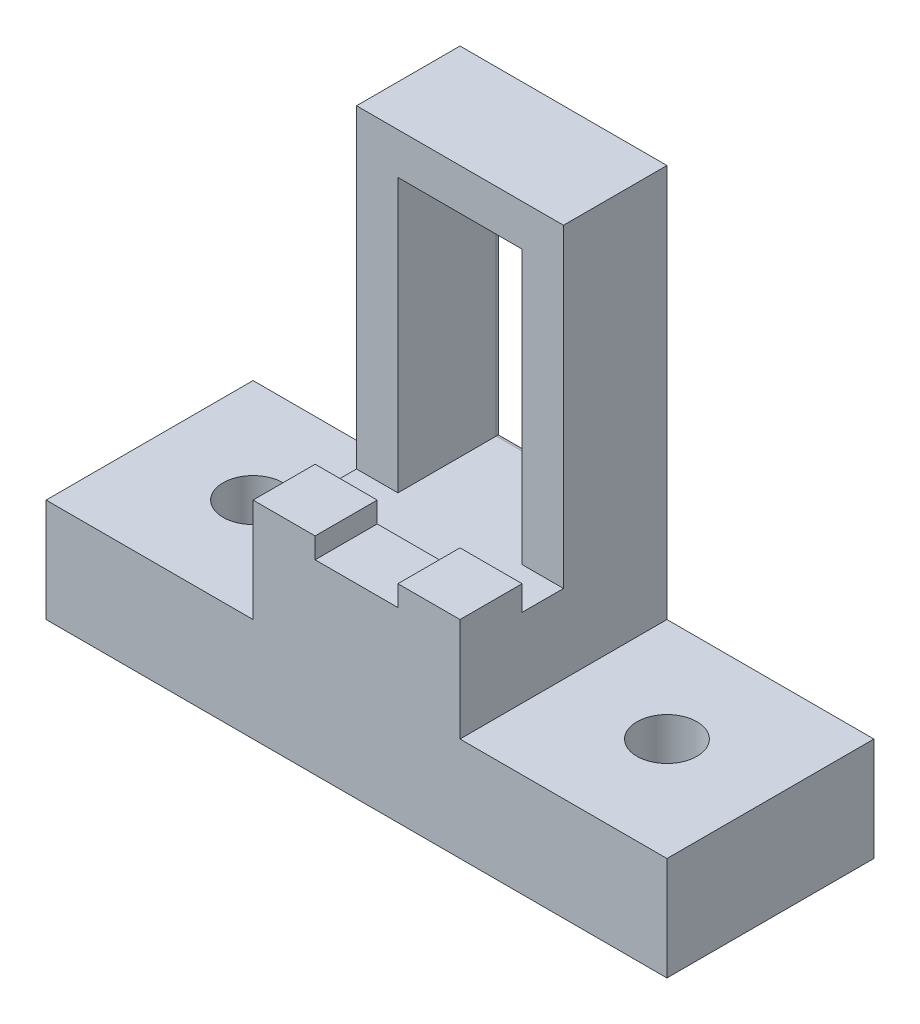
ISO-10303-21;
HEADER;
FILE_DESCRIPTION(('STEP AP214'),'2;1');
FILE_NAME('part.step','',(''),(''),'','','');
FILE_SCHEMA(('AUTOMOTIVE_DESIGN { 1 0 10303 214 1 1 1 1 }'));
ENDSEC;
DATA;
#1=APPLICATION_CONTEXT('core data for automotive mechanical design processes');
#2=APPLICATION_PROTOCOL_DEFINITION('international standard','automotive_design',2000,#1);
#3=PRODUCT_CONTEXT('',#1,'mechanical');
#4=PRODUCT('Part','Part','',(#3));
#5=PRODUCT_RELATED_PRODUCT_CATEGORY('part','',(#4));
#6=PRODUCT_DEFINITION_FORMATION('','',#4);
#7=PRODUCT_DEFINITION_CONTEXT('part definition',#1,'design');
#8=PRODUCT_DEFINITION('design','',#6,#7);
#9=PRODUCT_DEFINITION_SHAPE('','',#8);
#10=(LENGTH_UNIT() NAMED_UNIT(*) SI_UNIT(.MILLI.,.METRE.));
#11=(NAMED_UNIT(*) PLANE_ANGLE_UNIT() SI_UNIT($,.RADIAN.));
#12=(NAMED_UNIT(*) SI_UNIT($,.STERADIAN.) SOLID_ANGLE_UNIT());
#13=UNCERTAINTY_MEASURE_WITH_UNIT(LENGTH_MEASURE(1.E-05),#10,'distance_accuracy_value','');
#14=(GEOMETRIC_REPRESENTATION_CONTEXT(3) GLOBAL_UNCERTAINTY_ASSIGNED_CONTEXT((#13)) GLOBAL_UNIT_ASSIGNED_CONTEXT((#10,
#11,#12)) REPRESENTATION_CONTEXT('',''));
#15=CARTESIAN_POINT('',(0.,0.,0.));
#16=DIRECTION('',(0.,0.,1.));
#17=DIRECTION('',(1.,0.,0.));
#18=AXIS2_PLACEMENT_3D('',#15,#16,#17);
#19=CARTESIAN_POINT('',(-12.,8.8,-0.5));
#20=DIRECTION('',(0.,-1.,0.));
#21=DIRECTION('',(1.,0.,0.));
#22=AXIS2_PLACEMENT_3D('',#19,#20,#21);
#23=PLANE('',#22);
#24=DIRECTION('',(-1.,0.,0.));
#25=VECTOR('',#24,1.);
#26=CARTESIAN_POINT('',(-10.,8.8,-3.));
#27=LINE('',#26,#25);
#28=CARTESIAN_POINT('',(-10.,8.8,-3.));
#29=VERTEX_POINT('',#28);
#30=CARTESIAN_POINT('',(-20.,8.8,-3.));
#31=VERTEX_POINT('',#30);
#32=EDGE_CURVE('E367',#29,#31,#27,.T.);
#33=ORIENTED_EDGE('',*,*,#32,.F.);
#34=DIRECTION('',(0.,0.,-1.));
#35=VECTOR('',#34,1.);
#36=CARTESIAN_POINT('',(-10.,8.8,-5.));
#37=LINE('',#36,#35);
#38=CARTESIAN_POINT('',(-10.,8.8,-5.));
#39=VERTEX_POINT('',#38);
#40=EDGE_CURVE('E309',#29,#39,#37,.T.);
#41=ORIENTED_EDGE('',*,*,#40,.T.);
#42=DIRECTION('',(-1.,0.,0.));
#43=VECTOR('',#42,1.);
#44=CARTESIAN_POINT('',(-20.,8.8,-5.));
#45=LINE('',#44,#43);
#46=CARTESIAN_POINT('',(-12.,8.8,-5.));
#47=VERTEX_POINT('',#46);
#48=EDGE_CURVE('E311',#39,#47,#45,.T.);
#49=ORIENTED_EDGE('',*,*,#48,.T.);
#50=DIRECTION('',(0.,0.,-1.));
#51=VECTOR('',#50,1.);
#52=CARTESIAN_POINT('',(-12.,8.8,-0.5));
#53=LINE('',#52,#51);
#54=CARTESIAN_POINT('',(-12.,8.8,-9.75));
#55=VERTEX_POINT('',#54);
#56=EDGE_CURVE('E329',#47,#55,#53,.T.);
#57=ORIENTED_EDGE('',*,*,#56,.T.);
#58=DIRECTION('',(-1.,0.,0.));
#59=VECTOR('',#58,1.);
#60=CARTESIAN_POINT('',(-12.,8.8,-9.75));
#61=LINE('',#60,#59);
#62=CARTESIAN_POINT('',(-18.,8.8,-9.75));
#63=VERTEX_POINT('',#62);
#64=EDGE_CURVE('E245',#55,#63,#61,.T.);
#65=ORIENTED_EDGE('',*,*,#64,.T.);
#66=DIRECTION('',(0.,0.,-1.));
#67=VECTOR('',#66,1.);
#68=CARTESIAN_POINT('',(-18.,8.8,-0.5));
#69=LINE('',#68,#67);
#70=CARTESIAN_POINT('',(-18.,8.8,-5.));
#71=VERTEX_POINT('',#70);
#72=EDGE_CURVE('E335',#71,#63,#69,.T.);
#73=ORIENTED_EDGE('',*,*,#72,.F.);
#74=DIRECTION('',(1.,0.,0.));
#75=VECTOR('',#74,1.);
#76=CARTESIAN_POINT('',(-20.,8.8,-5.));
#77=LINE('',#76,#75);
#78=CARTESIAN_POINT('',(-20.,8.8,-5.));
#79=VERTEX_POINT('',#78);
#80=EDGE_CURVE('E235',#79,#71,#77,.T.);
#81=ORIENTED_EDGE('',*,*,#80,.F.);
#82=DIRECTION('',(0.,0.,1.));
#83=VECTOR('',#82,1.);
#84=CARTESIAN_POINT('',(-20.,8.8,-5.));
#85=LINE('',#84,#83);
#86=EDGE_CURVE('E307',#79,#31,#85,.T.);
#87=ORIENTED_EDGE('',*,*,#86,.T.);
#88=EDGE_LOOP('',(#33,#41,#49,#57,#65,#73,#81,#87));
#89=FACE_BOUND('',#88,.T.);
#90=ADVANCED_FACE('F35',(#89),#23,.F.);
#91=CARTESIAN_POINT('',(0.,10.,0.));
#92=DIRECTION('',(0.,1.,0.));
#93=DIRECTION('',(0.,0.,1.));
#94=AXIS2_PLACEMENT_3D('',#91,#92,#93);
#95=PLANE('',#94);
#96=DIRECTION('',(0.,0.,-1.));
#97=VECTOR('',#96,1.);
#98=CARTESIAN_POINT('',(-13.,10.,0.));
#99=LINE('',#98,#97);
#100=CARTESIAN_POINT('',(-13.,10.,0.));
#101=VERTEX_POINT('',#100);
#102=CARTESIAN_POINT('',(-13.,10.,-3.));
#103=VERTEX_POINT('',#102);
#104=EDGE_CURVE('E11',#101,#103,#99,.T.);
#105=ORIENTED_EDGE('',*,*,#104,.F.);
#106=DIRECTION('',(1.,0.,0.));
#107=VECTOR('',#106,1.);
#108=CARTESIAN_POINT('',(-20.,10.,0.));
#109=LINE('',#108,#107);
#110=CARTESIAN_POINT('',(-10.,10.,0.));
#111=VERTEX_POINT('',#110);
#112=EDGE_CURVE('E298',#101,#111,#109,.T.);
#113=ORIENTED_EDGE('',*,*,#112,.T.);
#114=DIRECTION('',(0.,0.,-1.));
#115=VECTOR('',#114,1.);
#116=CARTESIAN_POINT('',(-10.,10.,-2.6));
#117=LINE('',#116,#115);
#118=CARTESIAN_POINT('',(-10.,10.,-3.));
#119=VERTEX_POINT('',#118);
#120=EDGE_CURVE('E297',#111,#119,#117,.T.);
#121=ORIENTED_EDGE('',*,*,#120,.T.);
#122=DIRECTION('',(1.,0.,0.));
#123=VECTOR('',#122,1.);
#124=CARTESIAN_POINT('',(-13.,10.,-3.));
#125=LINE('',#124,#123);
#126=EDGE_CURVE('E370',#103,#119,#125,.T.);
#127=ORIENTED_EDGE('',*,*,#126,.F.);
#128=EDGE_LOOP('',(#105,#113,#121,#127));
#129=FACE_BOUND('',#128,.T.);
#130=ADVANCED_FACE('F397',(#129),#95,.T.);
#131=CARTESIAN_POINT('',(-30.,4.,0.));
#132=DIRECTION('',(0.,0.,-1.));
#133=DIRECTION('',(-1.,0.,0.));
#134=AXIS2_PLACEMENT_3D('',#131,#132,#133);
#135=PLANE('',#134);
#136=DIRECTION('',(0.,-1.,0.));
#137=VECTOR('',#136,1.);
#138=CARTESIAN_POINT('',(0.,4.,0.));
#139=LINE('',#138,#137);
#140=CARTESIAN_POINT('',(0.,5.,0.));
#141=VERTEX_POINT('',#140);
#142=CARTESIAN_POINT('',(0.,0.,0.));
#143=VERTEX_POINT('',#142);
#144=EDGE_CURVE('E232',#141,#143,#139,.T.);
#145=ORIENTED_EDGE('',*,*,#144,.F.);
#146=DIRECTION('',(1.,0.,0.));
#147=VECTOR('',#146,1.);
#148=CARTESIAN_POINT('',(-10.,5.,0.));
#149=LINE('',#148,#147);
#150=CARTESIAN_POINT('',(-10.,5.,0.));
#151=VERTEX_POINT('',#150);
#152=EDGE_CURVE('E207',#151,#141,#149,.T.);
#153=ORIENTED_EDGE('',*,*,#152,.F.);
#154=DIRECTION('',(0.,-1.,0.));
#155=VECTOR('',#154,1.);
#156=CARTESIAN_POINT('',(-10.,10.,0.));
#157=LINE('',#156,#155);
#158=EDGE_CURVE('E206',#111,#151,#157,.T.);
#159=ORIENTED_EDGE('',*,*,#158,.F.);
#160=ORIENTED_EDGE('',*,*,#112,.F.);
#161=DIRECTION('',(0.,1.,0.));
#162=VECTOR('',#161,1.);
#163=CARTESIAN_POINT('',(-13.,10.,0.));
#164=LINE('',#163,#162);
#165=CARTESIAN_POINT('',(-13.,9.,0.));
#166=VERTEX_POINT('',#165);
#167=EDGE_CURVE('E294',#166,#101,#164,.T.);
#168=ORIENTED_EDGE('',*,*,#167,.F.);
#169=DIRECTION('',(1.,0.,0.));
#170=VECTOR('',#169,1.);
#171=CARTESIAN_POINT('',(-17.,9.,0.));
#172=LINE('',#171,#170);
#173=CARTESIAN_POINT('',(-17.,9.,0.));
#174=VERTEX_POINT('',#173);
#175=EDGE_CURVE('E293',#174,#166,#172,.T.);
#176=ORIENTED_EDGE('',*,*,#175,.F.);
#177=DIRECTION('',(0.,-1.,0.));
#178=VECTOR('',#177,1.);
#179=CARTESIAN_POINT('',(-17.,10.,0.));
#180=LINE('',#179,#178);
#181=CARTESIAN_POINT('',(-17.,10.,0.));
#182=VERTEX_POINT('',#181);
#183=EDGE_CURVE('E279',#182,#174,#180,.T.);
#184=ORIENTED_EDGE('',*,*,#183,.F.);
#185=CARTESIAN_POINT('',(-20.,10.,0.));
#186=VERTEX_POINT('',#185);
#187=EDGE_CURVE('E289',#186,#182,#109,.T.);
#188=ORIENTED_EDGE('',*,*,#187,.F.);
#189=DIRECTION('',(0.,-1.,0.));
#190=VECTOR('',#189,1.);
#191=CARTESIAN_POINT('',(-20.,10.,0.));
#192=LINE('',#191,#190);
#193=CARTESIAN_POINT('',(-20.,5.,0.));
#194=VERTEX_POINT('',#193);
#195=EDGE_CURVE('E305',#186,#194,#192,.T.);
#196=ORIENTED_EDGE('',*,*,#195,.T.);
#197=DIRECTION('',(1.,0.,0.));
#198=VECTOR('',#197,1.);
#199=CARTESIAN_POINT('',(-30.,5.,0.));
#200=LINE('',#199,#198);
#201=CARTESIAN_POINT('',(-30.,5.,0.));
#202=VERTEX_POINT('',#201);
#203=EDGE_CURVE('E408',#202,#194,#200,.T.);
#204=ORIENTED_EDGE('',*,*,#203,.F.);
#205=DIRECTION('',(0.,-1.,0.));
#206=VECTOR('',#205,1.);
#207=CARTESIAN_POINT('',(-30.,4.,0.));
#208=LINE('',#207,#206);
#209=CARTESIAN_POINT('',(-30.,0.,0.));
#210=VERTEX_POINT('',#209);
#211=EDGE_CURVE('E224',#202,#210,#208,.T.);
#212=ORIENTED_EDGE('',*,*,#211,.T.);
#213=DIRECTION('',(1.,0.,0.));
#214=VECTOR('',#213,1.);
#215=CARTESIAN_POINT('',(-30.,0.,0.));
#216=LINE('',#215,#214);
#217=EDGE_CURVE('E222',#210,#143,#216,.T.);
#218=ORIENTED_EDGE('',*,*,#217,.T.);
#219=EDGE_LOOP('',(#145,#153,#159,#160,#168,#176,#184,#188,#196,#204,#212,#218));
#220=FACE_BOUND('',#219,.T.);
#221=ADVANCED_FACE('F288',(#220),#135,.F.);
#222=CARTESIAN_POINT('',(-20.,4.,0.));
#223=DIRECTION('',(1.,0.,0.));
#224=DIRECTION('',(0.,0.,-1.));
#225=AXIS2_PLACEMENT_3D('',#222,#223,#224);
#226=PLANE('',#225);
#227=DIRECTION('',(0.,-1.,0.));
#228=VECTOR('',#227,1.);
#229=CARTESIAN_POINT('',(-20.,24.,-10.));
#230=LINE('',#229,#228);
#231=CARTESIAN_POINT('',(-20.,24.,-10.));
#232=VERTEX_POINT('',#231);
#233=CARTESIAN_POINT('',(-20.,5.,-10.));
#234=VERTEX_POINT('',#233);
#235=EDGE_CURVE('E55',#232,#234,#230,.T.);
#236=ORIENTED_EDGE('',*,*,#235,.T.);
#237=DIRECTION('',(0.,0.,-1.));
#238=VECTOR('',#237,1.);
#239=CARTESIAN_POINT('',(-20.,5.,0.));
#240=LINE('',#239,#238);
#241=EDGE_CURVE('E50',#194,#234,#240,.T.);
#242=ORIENTED_EDGE('',*,*,#241,.F.);
#243=ORIENTED_EDGE('',*,*,#195,.F.);
#244=DIRECTION('',(0.,0.,1.));
#245=VECTOR('',#244,1.);
#246=CARTESIAN_POINT('',(-20.,10.,-2.6));
#247=LINE('',#246,#245);
#248=CARTESIAN_POINT('',(-20.,10.,-3.));
#249=VERTEX_POINT('',#248);
#250=EDGE_CURVE('E273',#249,#186,#247,.T.);
#251=ORIENTED_EDGE('',*,*,#250,.F.);
#252=DIRECTION('',(0.,1.,0.));
#253=VECTOR('',#252,1.);
#254=CARTESIAN_POINT('',(-20.,8.8,-3.));
#255=LINE('',#254,#253);
#256=EDGE_CURVE('E372',#31,#249,#255,.T.);
#257=ORIENTED_EDGE('',*,*,#256,.F.);
#258=ORIENTED_EDGE('',*,*,#86,.F.);
#259=DIRECTION('',(0.,1.,0.));
#260=VECTOR('',#259,1.);
#261=CARTESIAN_POINT('',(-20.,-7.18033988749895,-5.));
#262=LINE('',#261,#260);
#263=CARTESIAN_POINT('',(-20.,24.,-5.));
#264=VERTEX_POINT('',#263);
#265=EDGE_CURVE('E317',#79,#264,#262,.T.);
#266=ORIENTED_EDGE('',*,*,#265,.T.);
#267=DIRECTION('',(0.,0.,1.));
#268=VECTOR('',#267,1.);
#269=CARTESIAN_POINT('',(-20.,24.,5.00000000000001));
#270=LINE('',#269,#268);
#271=EDGE_CURVE('E243',#232,#264,#270,.T.);
#272=ORIENTED_EDGE('',*,*,#271,.F.);
#273=EDGE_LOOP('',(#236,#242,#243,#251,#257,#258,#266,#272));
#274=FACE_BOUND('',#273,.T.);
#275=ADVANCED_FACE('F349',(#274),#226,.F.);
#276=CARTESIAN_POINT('',(-10.,4.,5.00000000000001));
#277=DIRECTION('',(-1.,0.,0.));
#278=DIRECTION('',(0.,0.,1.));
#279=AXIS2_PLACEMENT_3D('',#276,#277,#278);
#280=PLANE('',#279);
#281=ORIENTED_EDGE('',*,*,#158,.T.);
#282=DIRECTION('',(0.,0.,1.));
#283=VECTOR('',#282,1.);
#284=CARTESIAN_POINT('',(-10.,5.,-10.));
#285=LINE('',#284,#283);
#286=CARTESIAN_POINT('',(-10.,5.,-10.));
#287=VERTEX_POINT('',#286);
#288=EDGE_CURVE('E188',#287,#151,#285,.T.);
#289=ORIENTED_EDGE('',*,*,#288,.F.);
#290=DIRECTION('',(0.,-1.,0.));
#291=VECTOR('',#290,1.);
#292=CARTESIAN_POINT('',(-10.,24.,-10.));
#293=LINE('',#292,#291);
#294=CARTESIAN_POINT('',(-10.,24.,-10.));
#295=VERTEX_POINT('',#294);
#296=EDGE_CURVE('E202',#295,#287,#293,.T.);
#297=ORIENTED_EDGE('',*,*,#296,.F.);
#298=DIRECTION('',(0.,0.,-1.));
#299=VECTOR('',#298,1.);
#300=CARTESIAN_POINT('',(-10.,24.,5.00000000000001));
#301=LINE('',#300,#299);
#302=CARTESIAN_POINT('',(-10.,24.,-5.));
#303=VERTEX_POINT('',#302);
#304=EDGE_CURVE('E342',#303,#295,#301,.T.);
#305=ORIENTED_EDGE('',*,*,#304,.F.);
#306=DIRECTION('',(0.,1.,0.));
#307=VECTOR('',#306,1.);
#308=CARTESIAN_POINT('',(-10.,-7.18033988749895,-5.));
#309=LINE('',#308,#307);
#310=EDGE_CURVE('E316',#39,#303,#309,.T.);
#311=ORIENTED_EDGE('',*,*,#310,.F.);
#312=ORIENTED_EDGE('',*,*,#40,.F.);
#313=DIRECTION('',(0.,-1.,0.));
#314=VECTOR('',#313,1.);
#315=CARTESIAN_POINT('',(-10.,10.,-3.));
#316=LINE('',#315,#314);
#317=EDGE_CURVE('E360',#119,#29,#316,.T.);
#318=ORIENTED_EDGE('',*,*,#317,.F.);
#319=ORIENTED_EDGE('',*,*,#120,.F.);
#320=EDGE_LOOP('',(#281,#289,#297,#305,#311,#312,#318,#319));
#321=FACE_BOUND('',#320,.T.);
#322=ADVANCED_FACE('F200',(#321),#280,.F.);
#323=CARTESIAN_POINT('',(0.,0.,0.));
#324=DIRECTION('',(0.,1.,0.));
#325=DIRECTION('',(0.,0.,1.));
#326=AXIS2_PLACEMENT_3D('',#323,#324,#325);
#327=PLANE('',#326);
#328=CARTESIAN_POINT('',(-5.,0.,-5.));
#329=DIRECTION('',(0.,1.,0.));
#330=DIRECTION('',(0.,0.,1.));
#331=AXIS2_PLACEMENT_3D('',#328,#329,#330);
#332=CIRCLE('',#331,1.45);
#333=CARTESIAN_POINT('',(-5.,0.,-3.55));
#334=VERTEX_POINT('',#333);
#335=EDGE_CURVE('E236',#334,#334,#332,.T.);
#336=ORIENTED_EDGE('',*,*,#335,.T.);
#337=EDGE_LOOP('',(#336));
#338=FACE_BOUND('',#337,.T.);
#339=CARTESIAN_POINT('',(-25.,0.,-5.));
#340=DIRECTION('',(0.,1.,0.));
#341=DIRECTION('',(0.,0.,1.));
#342=AXIS2_PLACEMENT_3D('',#339,#340,#341);
#343=CIRCLE('',#342,1.45);
#344=CARTESIAN_POINT('',(-25.,0.,-3.55));
#345=VERTEX_POINT('',#344);
#346=EDGE_CURVE('E239',#345,#345,#343,.T.);
#347=ORIENTED_EDGE('',*,*,#346,.T.);
#348=EDGE_LOOP('',(#347));
#349=FACE_BOUND('',#348,.T.);
#350=DIRECTION('',(0.,0.,-1.));
#351=VECTOR('',#350,1.);
#352=CARTESIAN_POINT('',(0.,0.,0.));
#353=LINE('',#352,#351);
#354=CARTESIAN_POINT('',(0.,0.,-10.));
#355=VERTEX_POINT('',#354);
#356=EDGE_CURVE('E212',#143,#355,#353,.T.);
#357=ORIENTED_EDGE('',*,*,#356,.F.);
#358=ORIENTED_EDGE('',*,*,#217,.F.);
#359=DIRECTION('',(0.,0.,1.));
#360=VECTOR('',#359,1.);
#361=CARTESIAN_POINT('',(-30.,0.,0.));
#362=LINE('',#361,#360);
#363=CARTESIAN_POINT('',(-30.,0.,-9.99999999999999));
#364=VERTEX_POINT('',#363);
#365=EDGE_CURVE('E220',#364,#210,#362,.T.);
#366=ORIENTED_EDGE('',*,*,#365,.F.);
#367=DIRECTION('',(-1.,0.,0.));
#368=VECTOR('',#367,1.);
#369=CARTESIAN_POINT('',(0.,0.,-10.));
#370=LINE('',#369,#368);
#371=EDGE_CURVE('E214',#355,#364,#370,.T.);
#372=ORIENTED_EDGE('',*,*,#371,.F.);
#373=EDGE_LOOP('',(#357,#358,#366,#372));
#374=FACE_BOUND('',#373,.T.);
#375=ADVANCED_FACE('F420',(#338,#349,#374),#327,.F.);
#376=CARTESIAN_POINT('',(0.,24.,0.));
#377=DIRECTION('',(0.,-1.,0.));
#378=DIRECTION('',(0.,0.,-1.));
#379=AXIS2_PLACEMENT_3D('',#376,#377,#378);
#380=PLANE('',#379);
#381=ORIENTED_EDGE('',*,*,#271,.T.);
#382=DIRECTION('',(-1.,0.,0.));
#383=VECTOR('',#382,1.);
#384=CARTESIAN_POINT('',(-20.,24.,-5.));
#385=LINE('',#384,#383);
#386=EDGE_CURVE('E313',#303,#264,#385,.T.);
#387=ORIENTED_EDGE('',*,*,#386,.F.);
#388=ORIENTED_EDGE('',*,*,#304,.T.);
#389=DIRECTION('',(-1.,0.,0.));
#390=VECTOR('',#389,1.);
#391=CARTESIAN_POINT('',(-20.,24.,-10.));
#392=LINE('',#391,#390);
#393=EDGE_CURVE('E211',#295,#232,#392,.T.);
#394=ORIENTED_EDGE('',*,*,#393,.T.);
#395=EDGE_LOOP('',(#381,#387,#388,#394));
#396=FACE_BOUND('',#395,.T.);
#397=ADVANCED_FACE('F344',(#396),#380,.F.);
#398=CARTESIAN_POINT('',(0.,4.,0.));
#399=DIRECTION('',(-1.,0.,0.));
#400=DIRECTION('',(0.,0.,1.));
#401=AXIS2_PLACEMENT_3D('',#398,#399,#400);
#402=PLANE('',#401);
#403=ORIENTED_EDGE('',*,*,#356,.T.);
#404=DIRECTION('',(0.,-1.,0.));
#405=VECTOR('',#404,1.);
#406=CARTESIAN_POINT('',(0.,4.,-10.));
#407=LINE('',#406,#405);
#408=CARTESIAN_POINT('',(0.,5.,-10.));
#409=VERTEX_POINT('',#408);
#410=EDGE_CURVE('E230',#409,#355,#407,.T.);
#411=ORIENTED_EDGE('',*,*,#410,.F.);
#412=DIRECTION('',(0.,0.,-1.));
#413=VECTOR('',#412,1.);
#414=CARTESIAN_POINT('',(0.,5.,0.));
#415=LINE('',#414,#413);
#416=EDGE_CURVE('E191',#141,#409,#415,.T.);
#417=ORIENTED_EDGE('',*,*,#416,.F.);
#418=ORIENTED_EDGE('',*,*,#144,.T.);
#419=EDGE_LOOP('',(#403,#411,#417,#418));
#420=FACE_BOUND('',#419,.T.);
#421=ADVANCED_FACE('F423',(#420),#402,.F.);
#422=CARTESIAN_POINT('',(0.,4.,-10.));
#423=DIRECTION('',(0.,0.,1.));
#424=DIRECTION('',(1.,0.,0.));
#425=AXIS2_PLACEMENT_3D('',#422,#423,#424);
#426=PLANE('',#425);
#427=DIRECTION('',(0.,-1.,0.));
#428=VECTOR('',#427,1.);
#429=CARTESIAN_POINT('',(-30.,4.,-9.99999999999999));
#430=LINE('',#429,#428);
#431=CARTESIAN_POINT('',(-30.,5.,-9.99999999999999));
#432=VERTEX_POINT('',#431);
#433=EDGE_CURVE('E227',#432,#364,#430,.T.);
#434=ORIENTED_EDGE('',*,*,#433,.F.);
#435=DIRECTION('',(-1.,0.,0.));
#436=VECTOR('',#435,1.);
#437=CARTESIAN_POINT('',(-20.,5.,-10.));
#438=LINE('',#437,#436);
#439=EDGE_CURVE('E348',#234,#432,#438,.T.);
#440=ORIENTED_EDGE('',*,*,#439,.F.);
#441=ORIENTED_EDGE('',*,*,#235,.F.);
#442=ORIENTED_EDGE('',*,*,#393,.F.);
#443=ORIENTED_EDGE('',*,*,#296,.T.);
#444=DIRECTION('',(-1.,0.,0.));
#445=VECTOR('',#444,1.);
#446=CARTESIAN_POINT('',(0.,5.,-10.));
#447=LINE('',#446,#445);
#448=EDGE_CURVE('E183',#409,#287,#447,.T.);
#449=ORIENTED_EDGE('',*,*,#448,.F.);
#450=ORIENTED_EDGE('',*,*,#410,.T.);
#451=ORIENTED_EDGE('',*,*,#371,.T.);
#452=EDGE_LOOP('',(#434,#440,#441,#442,#443,#449,#450,#451));
#453=FACE_BOUND('',#452,.T.);
#454=DIRECTION('',(1.,0.,0.));
#455=VECTOR('',#454,1.);
#456=CARTESIAN_POINT('',(0.,22.25,-10.));
#457=LINE('',#456,#455);
#458=CARTESIAN_POINT('',(-11.75,22.25,-10.));
#459=VERTEX_POINT('',#458);
#460=CARTESIAN_POINT('',(-18.25,22.25,-10.));
#461=VERTEX_POINT('',#460);
#462=EDGE_CURVE('E250',#459,#461,#457,.F.);
#463=ORIENTED_EDGE('',*,*,#462,.T.);
#464=DIRECTION('',(0.,1.,0.));
#465=VECTOR('',#464,1.);
#466=CARTESIAN_POINT('',(-18.25,4.,-10.));
#467=LINE('',#466,#465);
#468=CARTESIAN_POINT('',(-18.25,8.55,-10.));
#469=VERTEX_POINT('',#468);
#470=EDGE_CURVE('E255',#461,#469,#467,.F.);
#471=ORIENTED_EDGE('',*,*,#470,.T.);
#472=DIRECTION('',(-1.,0.,0.));
#473=VECTOR('',#472,1.);
#474=CARTESIAN_POINT('',(0.,8.55,-10.));
#475=LINE('',#474,#473);
#476=CARTESIAN_POINT('',(-11.75,8.55,-10.));
#477=VERTEX_POINT('',#476);
#478=EDGE_CURVE('E252',#469,#477,#475,.F.);
#479=ORIENTED_EDGE('',*,*,#478,.T.);
#480=DIRECTION('',(0.,-1.,0.));
#481=VECTOR('',#480,1.);
#482=CARTESIAN_POINT('',(-11.75,4.,-10.));
#483=LINE('',#482,#481);
#484=EDGE_CURVE('E248',#477,#459,#483,.F.);
#485=ORIENTED_EDGE('',*,*,#484,.T.);
#486=EDGE_LOOP('',(#463,#471,#479,#485));
#487=FACE_BOUND('',#486,.T.);
#488=ADVANCED_FACE('F209',(#453,#487),#426,.F.);
#489=CARTESIAN_POINT('',(-30.,4.,0.));
#490=DIRECTION('',(1.,0.,0.));
#491=DIRECTION('',(0.,0.,-1.));
#492=AXIS2_PLACEMENT_3D('',#489,#490,#491);
#493=PLANE('',#492);
#494=ORIENTED_EDGE('',*,*,#365,.T.);
#495=ORIENTED_EDGE('',*,*,#211,.F.);
#496=DIRECTION('',(0.,0.,1.));
#497=VECTOR('',#496,1.);
#498=CARTESIAN_POINT('',(-30.,5.,-9.99999999999999));
#499=LINE('',#498,#497);
#500=EDGE_CURVE('E405',#432,#202,#499,.T.);
#501=ORIENTED_EDGE('',*,*,#500,.F.);
#502=ORIENTED_EDGE('',*,*,#433,.T.);
#503=EDGE_LOOP('',(#494,#495,#501,#502));
#504=FACE_BOUND('',#503,.T.);
#505=ADVANCED_FACE('F424',(#504),#493,.F.);
#506=CARTESIAN_POINT('',(-5.,-16.,-5.));
#507=DIRECTION('',(0.,1.,0.));
#508=DIRECTION('',(0.,0.,1.));
#509=AXIS2_PLACEMENT_3D('',#506,#507,#508);
#510=CYLINDRICAL_SURFACE('',#509,1.45);
#511=ORIENTED_EDGE('',*,*,#335,.F.);
#512=EDGE_LOOP('',(#511));
#513=FACE_BOUND('',#512,.T.);
#514=CARTESIAN_POINT('',(-5.,5.,-5.));
#515=DIRECTION('',(0.,1.,0.));
#516=DIRECTION('',(0.,0.,1.));
#517=AXIS2_PLACEMENT_3D('',#514,#515,#516);
#518=CIRCLE('',#517,1.45);
#519=CARTESIAN_POINT('',(-5.,5.,-3.55));
#520=VERTEX_POINT('',#519);
#521=EDGE_CURVE('E195',#520,#520,#518,.T.);
#522=ORIENTED_EDGE('',*,*,#521,.T.);
#523=EDGE_LOOP('',(#522));
#524=FACE_BOUND('',#523,.T.);
#525=ADVANCED_FACE('F426',(#513,#524),#510,.F.);
#526=CARTESIAN_POINT('',(-25.,-16.,-5.));
#527=DIRECTION('',(0.,1.,0.));
#528=DIRECTION('',(0.,0.,1.));
#529=AXIS2_PLACEMENT_3D('',#526,#527,#528);
#530=CYLINDRICAL_SURFACE('',#529,1.45);
#531=ORIENTED_EDGE('',*,*,#346,.F.);
#532=EDGE_LOOP('',(#531));
#533=FACE_BOUND('',#532,.T.);
#534=CARTESIAN_POINT('',(-25.,5.,-5.));
#535=DIRECTION('',(0.,1.,0.));
#536=DIRECTION('',(0.,0.,1.));
#537=AXIS2_PLACEMENT_3D('',#534,#535,#536);
#538=CIRCLE('',#537,1.45);
#539=CARTESIAN_POINT('',(-25.,5.,-3.55));
#540=VERTEX_POINT('',#539);
#541=EDGE_CURVE('E400',#540,#540,#538,.T.);
#542=ORIENTED_EDGE('',*,*,#541,.T.);
#543=EDGE_LOOP('',(#542));
#544=FACE_BOUND('',#543,.T.);
#545=ADVANCED_FACE('F432',(#533,#544),#530,.F.);
#546=CARTESIAN_POINT('',(-12.,22.,-0.5));
#547=DIRECTION('',(1.,0.,0.));
#548=DIRECTION('',(0.,1.,0.));
#549=AXIS2_PLACEMENT_3D('',#546,#547,#548);
#550=PLANE('',#549);
#551=DIRECTION('',(0.,0.,-1.));
#552=VECTOR('',#551,1.);
#553=CARTESIAN_POINT('',(-12.,22.,-0.5));
#554=LINE('',#553,#552);
#555=CARTESIAN_POINT('',(-12.,22.,-5.));
#556=VERTEX_POINT('',#555);
#557=CARTESIAN_POINT('',(-12.,22.,-9.75));
#558=VERTEX_POINT('',#557);
#559=EDGE_CURVE('E240',#556,#558,#554,.T.);
#560=ORIENTED_EDGE('',*,*,#559,.T.);
#561=DIRECTION('',(0.,-1.,0.));
#562=VECTOR('',#561,1.);
#563=CARTESIAN_POINT('',(-12.,22.,-9.75));
#564=LINE('',#563,#562);
#565=EDGE_CURVE('E261',#558,#55,#564,.T.);
#566=ORIENTED_EDGE('',*,*,#565,.T.);
#567=ORIENTED_EDGE('',*,*,#56,.F.);
#568=DIRECTION('',(0.,1.,0.));
#569=VECTOR('',#568,1.);
#570=CARTESIAN_POINT('',(-12.,22.,-5.));
#571=LINE('',#570,#569);
#572=EDGE_CURVE('E326',#47,#556,#571,.T.);
#573=ORIENTED_EDGE('',*,*,#572,.T.);
#574=EDGE_LOOP('',(#560,#566,#567,#573));
#575=FACE_BOUND('',#574,.T.);
#576=ADVANCED_FACE('F447',(#575),#550,.F.);
#577=CARTESIAN_POINT('',(-12.,22.,-0.5));
#578=DIRECTION('',(0.,1.,0.));
#579=DIRECTION('',(0.,0.,1.));
#580=AXIS2_PLACEMENT_3D('',#577,#578,#579);
#581=PLANE('',#580);
#582=DIRECTION('',(0.,0.,-1.));
#583=VECTOR('',#582,1.);
#584=CARTESIAN_POINT('',(-18.,22.,-0.5));
#585=LINE('',#584,#583);
#586=CARTESIAN_POINT('',(-18.,22.,-5.));
#587=VERTEX_POINT('',#586);
#588=CARTESIAN_POINT('',(-18.,22.,-9.75));
#589=VERTEX_POINT('',#588);
#590=EDGE_CURVE('E332',#587,#589,#585,.T.);
#591=ORIENTED_EDGE('',*,*,#590,.T.);
#592=DIRECTION('',(1.,0.,0.));
#593=VECTOR('',#592,1.);
#594=CARTESIAN_POINT('',(-12.,22.,-9.75));
#595=LINE('',#594,#593);
#596=EDGE_CURVE('E257',#589,#558,#595,.T.);
#597=ORIENTED_EDGE('',*,*,#596,.T.);
#598=ORIENTED_EDGE('',*,*,#559,.F.);
#599=DIRECTION('',(-1.,0.,0.));
#600=VECTOR('',#599,1.);
#601=CARTESIAN_POINT('',(-12.,22.,-5.));
#602=LINE('',#601,#600);
#603=EDGE_CURVE('E323',#556,#587,#602,.T.);
#604=ORIENTED_EDGE('',*,*,#603,.T.);
#605=EDGE_LOOP('',(#591,#597,#598,#604));
#606=FACE_BOUND('',#605,.T.);
#607=ADVANCED_FACE('F450',(#606),#581,.F.);
#608=CARTESIAN_POINT('',(-18.,22.,-0.5));
#609=DIRECTION('',(-1.,0.,0.));
#610=DIRECTION('',(0.,0.,1.));
#611=AXIS2_PLACEMENT_3D('',#608,#609,#610);
#612=PLANE('',#611);
#613=ORIENTED_EDGE('',*,*,#72,.T.);
#614=DIRECTION('',(0.,1.,0.));
#615=VECTOR('',#614,1.);
#616=CARTESIAN_POINT('',(-18.,22.,-9.75));
#617=LINE('',#616,#615);
#618=EDGE_CURVE('E259',#63,#589,#617,.T.);
#619=ORIENTED_EDGE('',*,*,#618,.T.);
#620=ORIENTED_EDGE('',*,*,#590,.F.);
#621=DIRECTION('',(0.,-1.,0.));
#622=VECTOR('',#621,1.);
#623=CARTESIAN_POINT('',(-18.,22.,-5.));
#624=LINE('',#623,#622);
#625=EDGE_CURVE('E319',#587,#71,#624,.T.);
#626=ORIENTED_EDGE('',*,*,#625,.T.);
#627=EDGE_LOOP('',(#613,#619,#620,#626));
#628=FACE_BOUND('',#627,.T.);
#629=ADVANCED_FACE('F445',(#628),#612,.F.);
#630=CARTESIAN_POINT('',(-20.,-7.18033988749895,-5.));
#631=DIRECTION('',(0.,0.,-1.));
#632=DIRECTION('',(-1.,0.,0.));
#633=AXIS2_PLACEMENT_3D('',#630,#631,#632);
#634=PLANE('',#633);
#635=ORIENTED_EDGE('',*,*,#265,.F.);
#636=ORIENTED_EDGE('',*,*,#80,.T.);
#637=ORIENTED_EDGE('',*,*,#625,.F.);
#638=ORIENTED_EDGE('',*,*,#603,.F.);
#639=ORIENTED_EDGE('',*,*,#572,.F.);
#640=ORIENTED_EDGE('',*,*,#48,.F.);
#641=ORIENTED_EDGE('',*,*,#310,.T.);
#642=ORIENTED_EDGE('',*,*,#386,.T.);
#643=EDGE_LOOP('',(#635,#636,#637,#638,#639,#640,#641,#642));
#644=FACE_BOUND('',#643,.T.);
#645=ADVANCED_FACE('F354',(#644),#634,.F.);
#646=DIRECTION('',(0.,0.,1.));
#647=VECTOR('',#646,1.);
#648=CARTESIAN_POINT('',(-17.,10.,0.));
#649=LINE('',#648,#647);
#650=CARTESIAN_POINT('',(-17.,10.,-3.));
#651=VERTEX_POINT('',#650);
#652=EDGE_CURVE('E43',#651,#182,#649,.T.);
#653=ORIENTED_EDGE('',*,*,#652,.F.);
#654=DIRECTION('',(1.,0.,0.));
#655=VECTOR('',#654,1.);
#656=CARTESIAN_POINT('',(-20.,10.,-3.));
#657=LINE('',#656,#655);
#658=EDGE_CURVE('E379',#249,#651,#657,.T.);
#659=ORIENTED_EDGE('',*,*,#658,.F.);
#660=ORIENTED_EDGE('',*,*,#250,.T.);
#661=ORIENTED_EDGE('',*,*,#187,.T.);
#662=EDGE_LOOP('',(#653,#659,#660,#661));
#663=FACE_BOUND('',#662,.T.);
#664=ADVANCED_FACE('F296',(#663),#95,.T.);
#665=CARTESIAN_POINT('',(-12.,22.25,-9.75));
#666=DIRECTION('',(1.,0.,0.));
#667=DIRECTION('',(0.,0.,-1.));
#668=AXIS2_PLACEMENT_3D('',#665,#666,#667);
#669=CYLINDRICAL_SURFACE('',#668,0.25);
#670=CARTESIAN_POINT('',(-18.25,22.25,-9.75));
#671=DIRECTION('',(0.707106781186547,0.707106781186547,0.));
#672=DIRECTION('',(0.707106781186547,-0.707106781186547,0.));
#673=AXIS2_PLACEMENT_3D('',#670,#671,#672);
#674=ELLIPSE('',#673,0.353553390593274,0.25);
#675=EDGE_CURVE('E268',#461,#589,#674,.F.);
#676=ORIENTED_EDGE('',*,*,#675,.F.);
#677=ORIENTED_EDGE('',*,*,#462,.F.);
#678=CARTESIAN_POINT('',(-11.75,22.25,-9.75));
#679=DIRECTION('',(0.707106781186547,-0.707106781186548,0.));
#680=DIRECTION('',(0.707106781186548,0.707106781186547,0.));
#681=AXIS2_PLACEMENT_3D('',#678,#679,#680);
#682=ELLIPSE('',#681,0.353553390593274,0.25);
#683=EDGE_CURVE('E271',#558,#459,#682,.T.);
#684=ORIENTED_EDGE('',*,*,#683,.F.);
#685=ORIENTED_EDGE('',*,*,#596,.F.);
#686=EDGE_LOOP('',(#676,#677,#684,#685));
#687=FACE_BOUND('',#686,.T.);
#688=ADVANCED_FACE('F37',(#687),#669,.T.);
#689=CARTESIAN_POINT('',(-11.75,22.,-9.75));
#690=DIRECTION('',(0.,-1.,0.));
#691=DIRECTION('',(1.,0.,0.));
#692=AXIS2_PLACEMENT_3D('',#689,#690,#691);
#693=CYLINDRICAL_SURFACE('',#692,0.25);
#694=ORIENTED_EDGE('',*,*,#683,.T.);
#695=ORIENTED_EDGE('',*,*,#484,.F.);
#696=CARTESIAN_POINT('',(-11.75,8.55,-9.75));
#697=DIRECTION('',(-0.707106781186547,-0.707106781186547,0.));
#698=DIRECTION('',(-0.707106781186548,0.707106781186547,0.));
#699=AXIS2_PLACEMENT_3D('',#696,#697,#698);
#700=ELLIPSE('',#699,0.353553390593274,0.25);
#701=EDGE_CURVE('E265',#55,#477,#700,.T.);
#702=ORIENTED_EDGE('',*,*,#701,.F.);
#703=ORIENTED_EDGE('',*,*,#565,.F.);
#704=EDGE_LOOP('',(#694,#695,#702,#703));
#705=FACE_BOUND('',#704,.T.);
#706=ADVANCED_FACE('F574',(#705),#693,.T.);
#707=CARTESIAN_POINT('',(-18.25,22.,-9.75));
#708=DIRECTION('',(0.,1.,0.));
#709=DIRECTION('',(0.,0.,1.));
#710=AXIS2_PLACEMENT_3D('',#707,#708,#709);
#711=CYLINDRICAL_SURFACE('',#710,0.25);
#712=ORIENTED_EDGE('',*,*,#675,.T.);
#713=ORIENTED_EDGE('',*,*,#618,.F.);
#714=CARTESIAN_POINT('',(-18.25,8.55,-9.75));
#715=DIRECTION('',(-0.707106781186548,0.707106781186547,0.));
#716=DIRECTION('',(-0.707106781186547,-0.707106781186548,0.));
#717=AXIS2_PLACEMENT_3D('',#714,#715,#716);
#718=ELLIPSE('',#717,0.353553390593274,0.25);
#719=EDGE_CURVE('E263',#469,#63,#718,.F.);
#720=ORIENTED_EDGE('',*,*,#719,.F.);
#721=ORIENTED_EDGE('',*,*,#470,.F.);
#722=EDGE_LOOP('',(#712,#713,#720,#721));
#723=FACE_BOUND('',#722,.T.);
#724=ADVANCED_FACE('F566',(#723),#711,.T.);
#725=CARTESIAN_POINT('',(-12.,8.55,-9.75));
#726=DIRECTION('',(-1.,0.,0.));
#727=DIRECTION('',(0.,-1.,0.));
#728=AXIS2_PLACEMENT_3D('',#725,#726,#727);
#729=CYLINDRICAL_SURFACE('',#728,0.25);
#730=ORIENTED_EDGE('',*,*,#701,.T.);
#731=ORIENTED_EDGE('',*,*,#478,.F.);
#732=ORIENTED_EDGE('',*,*,#719,.T.);
#733=ORIENTED_EDGE('',*,*,#64,.F.);
#734=EDGE_LOOP('',(#730,#731,#732,#733));
#735=FACE_BOUND('',#734,.T.);
#736=ADVANCED_FACE('F542',(#735),#729,.T.);
#737=CARTESIAN_POINT('',(-17.,9.,-5.2));
#738=DIRECTION('',(0.,-1.,0.));
#739=DIRECTION('',(0.,0.,-1.));
#740=AXIS2_PLACEMENT_3D('',#737,#738,#739);
#741=PLANE('',#740);
#742=DIRECTION('',(0.,0.,1.));
#743=VECTOR('',#742,1.);
#744=CARTESIAN_POINT('',(-17.,9.,-5.2));
#745=LINE('',#744,#743);
#746=CARTESIAN_POINT('',(-17.,9.,-3.));
#747=VERTEX_POINT('',#746);
#748=EDGE_CURVE('E383',#747,#174,#745,.T.);
#749=ORIENTED_EDGE('',*,*,#748,.T.);
#750=ORIENTED_EDGE('',*,*,#175,.T.);
#751=DIRECTION('',(0.,0.,1.));
#752=VECTOR('',#751,1.);
#753=CARTESIAN_POINT('',(-13.,9.,-5.2));
#754=LINE('',#753,#752);
#755=CARTESIAN_POINT('',(-13.,9.,-3.));
#756=VERTEX_POINT('',#755);
#757=EDGE_CURVE('E266',#756,#166,#754,.T.);
#758=ORIENTED_EDGE('',*,*,#757,.F.);
#759=DIRECTION('',(1.,0.,0.));
#760=VECTOR('',#759,1.);
#761=CARTESIAN_POINT('',(-17.,9.,-3.));
#762=LINE('',#761,#760);
#763=EDGE_CURVE('E388',#747,#756,#762,.T.);
#764=ORIENTED_EDGE('',*,*,#763,.F.);
#765=EDGE_LOOP('',(#749,#750,#758,#764));
#766=FACE_BOUND('',#765,.T.);
#767=ADVANCED_FACE('F386',(#766),#741,.F.);
#768=CARTESIAN_POINT('',(-13.,10.,-5.2));
#769=DIRECTION('',(1.,0.,0.));
#770=DIRECTION('',(0.,0.,-1.));
#771=AXIS2_PLACEMENT_3D('',#768,#769,#770);
#772=PLANE('',#771);
#773=ORIENTED_EDGE('',*,*,#757,.T.);
#774=ORIENTED_EDGE('',*,*,#167,.T.);
#775=ORIENTED_EDGE('',*,*,#104,.T.);
#776=DIRECTION('',(0.,1.,0.));
#777=VECTOR('',#776,1.);
#778=CARTESIAN_POINT('',(-13.,9.,-3.));
#779=LINE('',#778,#777);
#780=EDGE_CURVE('E374',#756,#103,#779,.T.);
#781=ORIENTED_EDGE('',*,*,#780,.F.);
#782=EDGE_LOOP('',(#773,#774,#775,#781));
#783=FACE_BOUND('',#782,.T.);
#784=ADVANCED_FACE('F541',(#783),#772,.F.);
#785=CARTESIAN_POINT('',(-17.,10.,-5.2));
#786=DIRECTION('',(-1.,0.,0.));
#787=DIRECTION('',(0.,0.,1.));
#788=AXIS2_PLACEMENT_3D('',#785,#786,#787);
#789=PLANE('',#788);
#790=ORIENTED_EDGE('',*,*,#652,.T.);
#791=ORIENTED_EDGE('',*,*,#183,.T.);
#792=ORIENTED_EDGE('',*,*,#748,.F.);
#793=DIRECTION('',(0.,-1.,0.));
#794=VECTOR('',#793,1.);
#795=CARTESIAN_POINT('',(-17.,10.,-3.));
#796=LINE('',#795,#794);
#797=EDGE_CURVE('E282',#651,#747,#796,.T.);
#798=ORIENTED_EDGE('',*,*,#797,.F.);
#799=EDGE_LOOP('',(#790,#791,#792,#798));
#800=FACE_BOUND('',#799,.T.);
#801=ADVANCED_FACE('F278',(#800),#789,.F.);
#802=CARTESIAN_POINT('',(0.,0.,-3.));
#803=DIRECTION('',(0.,0.,1.));
#804=DIRECTION('',(1.,0.,0.));
#805=AXIS2_PLACEMENT_3D('',#802,#803,#804);
#806=PLANE('',#805);
#807=ORIENTED_EDGE('',*,*,#797,.T.);
#808=ORIENTED_EDGE('',*,*,#763,.T.);
#809=ORIENTED_EDGE('',*,*,#780,.T.);
#810=ORIENTED_EDGE('',*,*,#126,.T.);
#811=ORIENTED_EDGE('',*,*,#317,.T.);
#812=ORIENTED_EDGE('',*,*,#32,.T.);
#813=ORIENTED_EDGE('',*,*,#256,.T.);
#814=ORIENTED_EDGE('',*,*,#658,.T.);
#815=EDGE_LOOP('',(#807,#808,#809,#810,#811,#812,#813,#814));
#816=FACE_BOUND('',#815,.T.);
#817=ADVANCED_FACE('F365',(#816),#806,.F.);
#818=CARTESIAN_POINT('',(0.,5.,0.));
#819=DIRECTION('',(0.,1.,0.));
#820=DIRECTION('',(0.,0.,1.));
#821=AXIS2_PLACEMENT_3D('',#818,#819,#820);
#822=PLANE('',#821);
#823=ORIENTED_EDGE('',*,*,#500,.T.);
#824=ORIENTED_EDGE('',*,*,#203,.T.);
#825=ORIENTED_EDGE('',*,*,#241,.T.);
#826=ORIENTED_EDGE('',*,*,#439,.T.);
#827=EDGE_LOOP('',(#823,#824,#825,#826));
#828=FACE_BOUND('',#827,.T.);
#829=ORIENTED_EDGE('',*,*,#541,.F.);
#830=EDGE_LOOP('',(#829));
#831=FACE_BOUND('',#830,.T.);
#832=ADVANCED_FACE('F411',(#828,#831),#822,.T.);
#833=CARTESIAN_POINT('',(0.,5.,0.));
#834=DIRECTION('',(0.,1.,0.));
#835=DIRECTION('',(0.,0.,1.));
#836=AXIS2_PLACEMENT_3D('',#833,#834,#835);
#837=PLANE('',#836);
#838=ORIENTED_EDGE('',*,*,#448,.T.);
#839=ORIENTED_EDGE('',*,*,#288,.T.);
#840=ORIENTED_EDGE('',*,*,#152,.T.);
#841=ORIENTED_EDGE('',*,*,#416,.T.);
#842=EDGE_LOOP('',(#838,#839,#840,#841));
#843=FACE_BOUND('',#842,.T.);
#844=ORIENTED_EDGE('',*,*,#521,.F.);
#845=EDGE_LOOP('',(#844));
#846=FACE_BOUND('',#845,.T.);
#847=ADVANCED_FACE('F185',(#843,#846),#837,.T.);
#848=CLOSED_SHELL('',(#90,#130,#221,#275,#322,#375,#397,#421,#488,#505,#525,#545,#576,#607,#629,
#645,#664,#688,#706,#724,#736,#767,#784,#801,#817,#832,#847));
#849=MANIFOLD_SOLID_BREP('B2',#848);
#850=ADVANCED_BREP_SHAPE_REPRESENTATION('',(#18,#849),#14);
#851=SHAPE_DEFINITION_REPRESENTATION(#9,#850);
ENDSEC;
END-ISO-10303-21;
